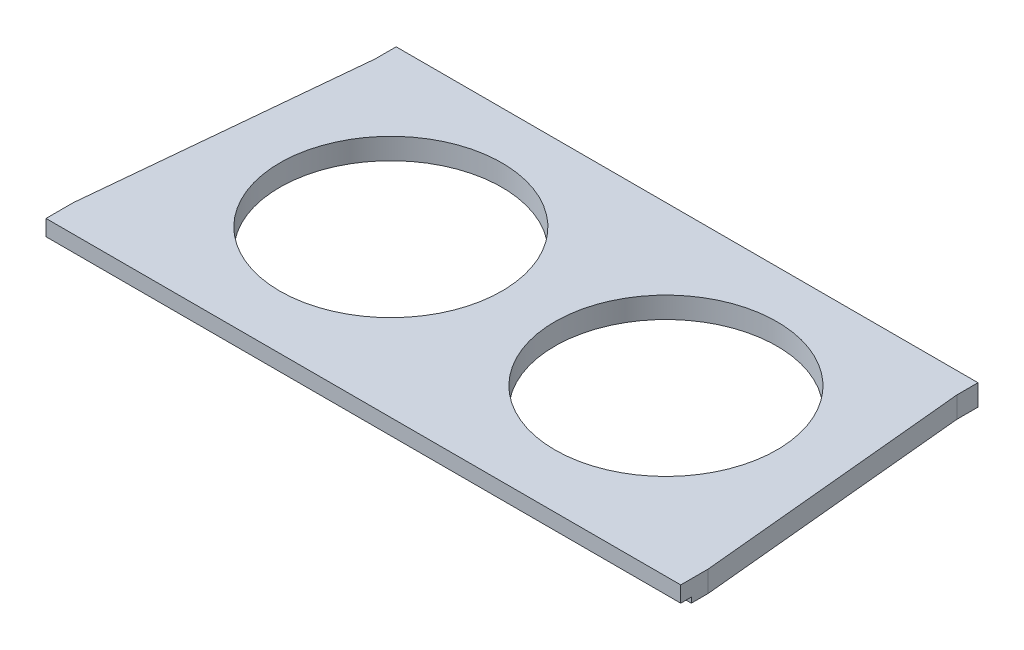
ISO-10303-21;
HEADER;
FILE_DESCRIPTION(('STEP AP214'),'2;1');
FILE_NAME('part.step','',(''),(''),'','','');
FILE_SCHEMA(('AUTOMOTIVE_DESIGN { 1 0 10303 214 1 1 1 1 }'));
ENDSEC;
DATA;
#1=APPLICATION_CONTEXT('core data for automotive mechanical design processes');
#2=APPLICATION_PROTOCOL_DEFINITION('international standard','automotive_design',2000,#1);
#3=PRODUCT_CONTEXT('',#1,'mechanical');
#4=PRODUCT('Part','Part','',(#3));
#5=PRODUCT_RELATED_PRODUCT_CATEGORY('part','',(#4));
#6=PRODUCT_DEFINITION_FORMATION('','',#4);
#7=PRODUCT_DEFINITION_CONTEXT('part definition',#1,'design');
#8=PRODUCT_DEFINITION('design','',#6,#7);
#9=PRODUCT_DEFINITION_SHAPE('','',#8);
#10=(LENGTH_UNIT() NAMED_UNIT(*) SI_UNIT(.MILLI.,.METRE.));
#11=(NAMED_UNIT(*) PLANE_ANGLE_UNIT() SI_UNIT($,.RADIAN.));
#12=(NAMED_UNIT(*) SI_UNIT($,.STERADIAN.) SOLID_ANGLE_UNIT());
#13=UNCERTAINTY_MEASURE_WITH_UNIT(LENGTH_MEASURE(1.E-05),#10,'distance_accuracy_value','');
#14=(GEOMETRIC_REPRESENTATION_CONTEXT(3) GLOBAL_UNCERTAINTY_ASSIGNED_CONTEXT((#13)) GLOBAL_UNIT_ASSIGNED_CONTEXT((#10,
#11,#12)) REPRESENTATION_CONTEXT('',''));
#15=CARTESIAN_POINT('',(0.,0.,0.));
#16=DIRECTION('',(0.,0.,1.));
#17=DIRECTION('',(1.,0.,0.));
#18=AXIS2_PLACEMENT_3D('',#15,#16,#17);
#19=CARTESIAN_POINT('',(0.,5.,0.));
#20=DIRECTION('',(0.,1.,0.));
#21=DIRECTION('',(0.,0.,1.));
#22=AXIS2_PLACEMENT_3D('',#19,#20,#21);
#23=PLANE('',#22);
#24=DIRECTION('',(-1.,0.,0.));
#25=VECTOR('',#24,1.);
#26=CARTESIAN_POINT('',(0.,5.,156.));
#27=LINE('',#26,#25);
#28=CARTESIAN_POINT('',(300.,5.,156.));
#29=VERTEX_POINT('',#28);
#30=CARTESIAN_POINT('',(-300.,5.,156.));
#31=VERTEX_POINT('',#30);
#32=EDGE_CURVE('E199',#29,#31,#27,.T.);
#33=ORIENTED_EDGE('',*,*,#32,.T.);
#34=DIRECTION('',(0.,0.,-1.));
#35=VECTOR('',#34,1.);
#36=CARTESIAN_POINT('',(-300.,5.,150.));
#37=LINE('',#36,#35);
#38=CARTESIAN_POINT('',(-300.,5.,146.));
#39=VERTEX_POINT('',#38);
#40=EDGE_CURVE('E204',#31,#39,#37,.T.);
#41=ORIENTED_EDGE('',*,*,#40,.T.);
#42=DIRECTION('',(-1.,0.,0.));
#43=VECTOR('',#42,1.);
#44=CARTESIAN_POINT('',(300.,5.,146.));
#45=LINE('',#44,#43);
#46=CARTESIAN_POINT('',(300.,5.,146.));
#47=VERTEX_POINT('',#46);
#48=EDGE_CURVE('E122',#39,#47,#45,.F.);
#49=ORIENTED_EDGE('',*,*,#48,.T.);
#50=DIRECTION('',(0.,0.,1.));
#51=VECTOR('',#50,1.);
#52=CARTESIAN_POINT('',(300.,5.,150.));
#53=LINE('',#52,#51);
#54=EDGE_CURVE('E193',#47,#29,#53,.T.);
#55=ORIENTED_EDGE('',*,*,#54,.T.);
#56=EDGE_LOOP('',(#33,#41,#49,#55));
#57=FACE_BOUND('',#56,.T.);
#58=ADVANCED_FACE('F16',(#57),#23,.F.);
#59=CARTESIAN_POINT('',(300.,5.,146.));
#60=DIRECTION('',(0.,0.,-1.));
#61=DIRECTION('',(-1.,0.,0.));
#62=AXIS2_PLACEMENT_3D('',#59,#60,#61);
#63=PLANE('',#62);
#64=DIRECTION('',(0.,1.,0.));
#65=VECTOR('',#64,1.);
#66=CARTESIAN_POINT('',(300.,20.,146.));
#67=LINE('',#66,#65);
#68=CARTESIAN_POINT('',(300.,0.,146.));
#69=VERTEX_POINT('',#68);
#70=EDGE_CURVE('E113',#69,#47,#67,.T.);
#71=ORIENTED_EDGE('',*,*,#70,.T.);
#72=ORIENTED_EDGE('',*,*,#48,.F.);
#73=DIRECTION('',(0.,1.,0.));
#74=VECTOR('',#73,1.);
#75=CARTESIAN_POINT('',(-300.,20.,146.));
#76=LINE('',#75,#74);
#77=CARTESIAN_POINT('',(-300.,0.,146.));
#78=VERTEX_POINT('',#77);
#79=EDGE_CURVE('E207',#39,#78,#76,.F.);
#80=ORIENTED_EDGE('',*,*,#79,.T.);
#81=DIRECTION('',(1.,0.,0.));
#82=VECTOR('',#81,1.);
#83=CARTESIAN_POINT('',(0.,0.,146.));
#84=LINE('',#83,#82);
#85=EDGE_CURVE('E90',#69,#78,#84,.F.);
#86=ORIENTED_EDGE('',*,*,#85,.F.);
#87=EDGE_LOOP('',(#71,#72,#80,#86));
#88=FACE_BOUND('',#87,.T.);
#89=ADVANCED_FACE('F185',(#88),#63,.F.);
#90=CARTESIAN_POINT('',(0.,0.,0.));
#91=DIRECTION('',(0.,-1.,0.));
#92=DIRECTION('',(0.,0.,-1.));
#93=AXIS2_PLACEMENT_3D('',#90,#91,#92);
#94=PLANE('',#93);
#95=CARTESIAN_POINT('',(130.,0.,0.));
#96=DIRECTION('',(0.,1.,0.));
#97=DIRECTION('',(0.,0.,1.));
#98=AXIS2_PLACEMENT_3D('',#95,#96,#97);
#99=CIRCLE('',#98,105.);
#100=CARTESIAN_POINT('',(130.,0.,105.));
#101=VERTEX_POINT('',#100);
#102=EDGE_CURVE('E106',#101,#101,#99,.T.);
#103=ORIENTED_EDGE('',*,*,#102,.T.);
#104=EDGE_LOOP('',(#103));
#105=FACE_BOUND('',#104,.T.);
#106=CARTESIAN_POINT('',(-130.,0.,0.));
#107=DIRECTION('',(0.,1.,0.));
#108=DIRECTION('',(0.,0.,1.));
#109=AXIS2_PLACEMENT_3D('',#106,#107,#108);
#110=CIRCLE('',#109,105.);
#111=CARTESIAN_POINT('',(-130.,0.,105.));
#112=VERTEX_POINT('',#111);
#113=EDGE_CURVE('E19',#112,#112,#110,.T.);
#114=ORIENTED_EDGE('',*,*,#113,.T.);
#115=EDGE_LOOP('',(#114));
#116=FACE_BOUND('',#115,.T.);
#117=DIRECTION('',(-0.0957124066442579,0.,-0.995409029100281));
#118=VECTOR('',#117,1.);
#119=CARTESIAN_POINT('',(275.,0.,-130.));
#120=LINE('',#119,#118);
#121=CARTESIAN_POINT('',(300.,0.,130.));
#122=VERTEX_POINT('',#121);
#123=CARTESIAN_POINT('',(275.,0.,-130.));
#124=VERTEX_POINT('',#123);
#125=EDGE_CURVE('E96',#122,#124,#120,.T.);
#126=ORIENTED_EDGE('',*,*,#125,.F.);
#127=DIRECTION('',(0.,0.,1.));
#128=VECTOR('',#127,1.);
#129=CARTESIAN_POINT('',(300.,0.,150.));
#130=LINE('',#129,#128);
#131=EDGE_CURVE('E99',#122,#69,#130,.T.);
#132=ORIENTED_EDGE('',*,*,#131,.T.);
#133=ORIENTED_EDGE('',*,*,#85,.T.);
#134=DIRECTION('',(0.,0.,-1.));
#135=VECTOR('',#134,1.);
#136=CARTESIAN_POINT('',(-300.,0.,150.));
#137=LINE('',#136,#135);
#138=CARTESIAN_POINT('',(-300.,0.,130.));
#139=VERTEX_POINT('',#138);
#140=EDGE_CURVE('E209',#78,#139,#137,.T.);
#141=ORIENTED_EDGE('',*,*,#140,.T.);
#142=DIRECTION('',(0.0957124066442579,0.,-0.995409029100281));
#143=VECTOR('',#142,1.);
#144=CARTESIAN_POINT('',(-275.,0.,-130.));
#145=LINE('',#144,#143);
#146=CARTESIAN_POINT('',(-275.,0.,-130.));
#147=VERTEX_POINT('',#146);
#148=EDGE_CURVE('E214',#139,#147,#145,.T.);
#149=ORIENTED_EDGE('',*,*,#148,.T.);
#150=DIRECTION('',(0.,0.,-1.));
#151=VECTOR('',#150,1.);
#152=CARTESIAN_POINT('',(-275.,0.,-130.));
#153=LINE('',#152,#151);
#154=CARTESIAN_POINT('',(-275.,0.,-150.));
#155=VERTEX_POINT('',#154);
#156=EDGE_CURVE('E219',#147,#155,#153,.T.);
#157=ORIENTED_EDGE('',*,*,#156,.T.);
#158=DIRECTION('',(1.,0.,0.));
#159=VECTOR('',#158,1.);
#160=CARTESIAN_POINT('',(-300.,0.,-150.));
#161=LINE('',#160,#159);
#162=CARTESIAN_POINT('',(275.,0.,-150.));
#163=VERTEX_POINT('',#162);
#164=EDGE_CURVE('E224',#155,#163,#161,.T.);
#165=ORIENTED_EDGE('',*,*,#164,.T.);
#166=DIRECTION('',(0.,0.,-1.));
#167=VECTOR('',#166,1.);
#168=CARTESIAN_POINT('',(275.,0.,-130.));
#169=LINE('',#168,#167);
#170=EDGE_CURVE('E100',#124,#163,#169,.T.);
#171=ORIENTED_EDGE('',*,*,#170,.F.);
#172=EDGE_LOOP('',(#126,#132,#133,#141,#149,#157,#165,#171));
#173=FACE_BOUND('',#172,.T.);
#174=ADVANCED_FACE('F98',(#105,#116,#173),#94,.T.);
#175=CARTESIAN_POINT('',(-130.,0.,0.));
#176=DIRECTION('',(0.,1.,0.));
#177=DIRECTION('',(0.,0.,1.));
#178=AXIS2_PLACEMENT_3D('',#175,#176,#177);
#179=CYLINDRICAL_SURFACE('',#178,105.);
#180=ORIENTED_EDGE('',*,*,#113,.F.);
#181=EDGE_LOOP('',(#180));
#182=FACE_BOUND('',#181,.T.);
#183=CARTESIAN_POINT('',(-130.,20.,0.));
#184=DIRECTION('',(0.,1.,0.));
#185=DIRECTION('',(0.,0.,1.));
#186=AXIS2_PLACEMENT_3D('',#183,#184,#185);
#187=CIRCLE('',#186,105.);
#188=CARTESIAN_POINT('',(-130.,20.,105.));
#189=VERTEX_POINT('',#188);
#190=EDGE_CURVE('E127',#189,#189,#187,.T.);
#191=ORIENTED_EDGE('',*,*,#190,.T.);
#192=EDGE_LOOP('',(#191));
#193=FACE_BOUND('',#192,.T.);
#194=ADVANCED_FACE('F136',(#182,#193),#179,.F.);
#195=CARTESIAN_POINT('',(130.,0.,0.));
#196=DIRECTION('',(0.,1.,0.));
#197=DIRECTION('',(0.,0.,1.));
#198=AXIS2_PLACEMENT_3D('',#195,#196,#197);
#199=CYLINDRICAL_SURFACE('',#198,105.);
#200=ORIENTED_EDGE('',*,*,#102,.F.);
#201=EDGE_LOOP('',(#200));
#202=FACE_BOUND('',#201,.T.);
#203=CARTESIAN_POINT('',(130.,20.,0.));
#204=DIRECTION('',(0.,1.,0.));
#205=DIRECTION('',(0.,0.,1.));
#206=AXIS2_PLACEMENT_3D('',#203,#204,#205);
#207=CIRCLE('',#206,105.);
#208=CARTESIAN_POINT('',(130.,20.,105.));
#209=VERTEX_POINT('',#208);
#210=EDGE_CURVE('E124',#209,#209,#207,.T.);
#211=ORIENTED_EDGE('',*,*,#210,.T.);
#212=EDGE_LOOP('',(#211));
#213=FACE_BOUND('',#212,.T.);
#214=ADVANCED_FACE('F139',(#202,#213),#199,.F.);
#215=CARTESIAN_POINT('',(275.,883.898086778126,-130.));
#216=DIRECTION('',(0.995409029100281,0.,-0.0957124066442579));
#217=DIRECTION('',(-0.0957124066442579,0.,-0.995409029100281));
#218=AXIS2_PLACEMENT_3D('',#215,#216,#217);
#219=PLANE('',#218);
#220=DIRECTION('',(0.,1.,0.));
#221=VECTOR('',#220,1.);
#222=CARTESIAN_POINT('',(300.,20.,130.));
#223=LINE('',#222,#221);
#224=CARTESIAN_POINT('',(300.,20.,130.));
#225=VERTEX_POINT('',#224);
#226=EDGE_CURVE('E105',#225,#122,#223,.F.);
#227=ORIENTED_EDGE('',*,*,#226,.T.);
#228=ORIENTED_EDGE('',*,*,#125,.T.);
#229=DIRECTION('',(0.,1.,0.));
#230=VECTOR('',#229,1.);
#231=CARTESIAN_POINT('',(275.,883.898086778126,-130.));
#232=LINE('',#231,#230);
#233=CARTESIAN_POINT('',(275.,20.,-130.));
#234=VERTEX_POINT('',#233);
#235=EDGE_CURVE('E227',#234,#124,#232,.F.);
#236=ORIENTED_EDGE('',*,*,#235,.F.);
#237=DIRECTION('',(0.0957124066442579,0.,0.995409029100281));
#238=VECTOR('',#237,1.);
#239=CARTESIAN_POINT('',(275.,20.,-130.));
#240=LINE('',#239,#238);
#241=EDGE_CURVE('E117',#234,#225,#240,.T.);
#242=ORIENTED_EDGE('',*,*,#241,.T.);
#243=EDGE_LOOP('',(#227,#228,#236,#242));
#244=FACE_BOUND('',#243,.T.);
#245=ADVANCED_FACE('F116',(#244),#219,.T.);
#246=CARTESIAN_POINT('',(300.,20.,150.));
#247=DIRECTION('',(-1.,0.,0.));
#248=DIRECTION('',(0.,0.,1.));
#249=AXIS2_PLACEMENT_3D('',#246,#247,#248);
#250=PLANE('',#249);
#251=ORIENTED_EDGE('',*,*,#70,.F.);
#252=ORIENTED_EDGE('',*,*,#131,.F.);
#253=ORIENTED_EDGE('',*,*,#226,.F.);
#254=DIRECTION('',(0.,0.,-1.));
#255=VECTOR('',#254,1.);
#256=CARTESIAN_POINT('',(300.,20.,0.));
#257=LINE('',#256,#255);
#258=CARTESIAN_POINT('',(300.,20.,156.));
#259=VERTEX_POINT('',#258);
#260=EDGE_CURVE('E231',#225,#259,#257,.F.);
#261=ORIENTED_EDGE('',*,*,#260,.T.);
#262=DIRECTION('',(0.,1.,0.));
#263=VECTOR('',#262,1.);
#264=CARTESIAN_POINT('',(300.,0.,156.));
#265=LINE('',#264,#263);
#266=EDGE_CURVE('E194',#259,#29,#265,.F.);
#267=ORIENTED_EDGE('',*,*,#266,.T.);
#268=ORIENTED_EDGE('',*,*,#54,.F.);
#269=EDGE_LOOP('',(#251,#252,#253,#261,#267,#268));
#270=FACE_BOUND('',#269,.T.);
#271=ADVANCED_FACE('F109',(#270),#250,.F.);
#272=CARTESIAN_POINT('',(0.,0.,156.));
#273=DIRECTION('',(0.,0.,-1.));
#274=DIRECTION('',(-1.,0.,0.));
#275=AXIS2_PLACEMENT_3D('',#272,#273,#274);
#276=PLANE('',#275);
#277=ORIENTED_EDGE('',*,*,#32,.F.);
#278=ORIENTED_EDGE('',*,*,#266,.F.);
#279=DIRECTION('',(1.,0.,0.));
#280=VECTOR('',#279,1.);
#281=CARTESIAN_POINT('',(0.,20.,156.));
#282=LINE('',#281,#280);
#283=CARTESIAN_POINT('',(-300.,20.,156.));
#284=VERTEX_POINT('',#283);
#285=EDGE_CURVE('E233',#259,#284,#282,.F.);
#286=ORIENTED_EDGE('',*,*,#285,.T.);
#287=DIRECTION('',(0.,1.,0.));
#288=VECTOR('',#287,1.);
#289=CARTESIAN_POINT('',(-300.,20.,156.));
#290=LINE('',#289,#288);
#291=EDGE_CURVE('E201',#284,#31,#290,.F.);
#292=ORIENTED_EDGE('',*,*,#291,.T.);
#293=EDGE_LOOP('',(#277,#278,#286,#292));
#294=FACE_BOUND('',#293,.T.);
#295=ADVANCED_FACE('F172',(#294),#276,.F.);
#296=CARTESIAN_POINT('',(-300.,20.,150.));
#297=DIRECTION('',(1.,0.,0.));
#298=DIRECTION('',(0.,0.,-1.));
#299=AXIS2_PLACEMENT_3D('',#296,#297,#298);
#300=PLANE('',#299);
#301=ORIENTED_EDGE('',*,*,#79,.F.);
#302=ORIENTED_EDGE('',*,*,#40,.F.);
#303=ORIENTED_EDGE('',*,*,#291,.F.);
#304=DIRECTION('',(0.,0.,-1.));
#305=VECTOR('',#304,1.);
#306=CARTESIAN_POINT('',(-300.,20.,0.));
#307=LINE('',#306,#305);
#308=CARTESIAN_POINT('',(-300.,20.,130.));
#309=VERTEX_POINT('',#308);
#310=EDGE_CURVE('E236',#284,#309,#307,.T.);
#311=ORIENTED_EDGE('',*,*,#310,.T.);
#312=DIRECTION('',(0.,1.,0.));
#313=VECTOR('',#312,1.);
#314=CARTESIAN_POINT('',(-300.,883.898086778126,130.));
#315=LINE('',#314,#313);
#316=EDGE_CURVE('E211',#309,#139,#315,.F.);
#317=ORIENTED_EDGE('',*,*,#316,.T.);
#318=ORIENTED_EDGE('',*,*,#140,.F.);
#319=EDGE_LOOP('',(#301,#302,#303,#311,#317,#318));
#320=FACE_BOUND('',#319,.T.);
#321=ADVANCED_FACE('F168',(#320),#300,.F.);
#322=CARTESIAN_POINT('',(-275.,883.898086778126,-130.));
#323=DIRECTION('',(0.995409029100281,0.,0.0957124066442579));
#324=DIRECTION('',(0.0957124066442579,0.,-0.995409029100281));
#325=AXIS2_PLACEMENT_3D('',#322,#323,#324);
#326=PLANE('',#325);
#327=DIRECTION('',(0.,1.,0.));
#328=VECTOR('',#327,1.);
#329=CARTESIAN_POINT('',(-275.,883.898086778126,-130.));
#330=LINE('',#329,#328);
#331=CARTESIAN_POINT('',(-275.,20.,-130.));
#332=VERTEX_POINT('',#331);
#333=EDGE_CURVE('E216',#332,#147,#330,.F.);
#334=ORIENTED_EDGE('',*,*,#333,.T.);
#335=ORIENTED_EDGE('',*,*,#148,.F.);
#336=ORIENTED_EDGE('',*,*,#316,.F.);
#337=DIRECTION('',(0.095712406644258,0.,-0.995409029100281));
#338=VECTOR('',#337,1.);
#339=CARTESIAN_POINT('',(-300.,20.,130.));
#340=LINE('',#339,#338);
#341=EDGE_CURVE('E239',#309,#332,#340,.T.);
#342=ORIENTED_EDGE('',*,*,#341,.T.);
#343=EDGE_LOOP('',(#334,#335,#336,#342));
#344=FACE_BOUND('',#343,.T.);
#345=ADVANCED_FACE('F164',(#344),#326,.F.);
#346=CARTESIAN_POINT('',(-275.,883.898086778126,-130.));
#347=DIRECTION('',(1.,0.,0.));
#348=DIRECTION('',(0.,0.,-1.));
#349=AXIS2_PLACEMENT_3D('',#346,#347,#348);
#350=PLANE('',#349);
#351=DIRECTION('',(0.,1.,0.));
#352=VECTOR('',#351,1.);
#353=CARTESIAN_POINT('',(-275.,20.,-150.));
#354=LINE('',#353,#352);
#355=CARTESIAN_POINT('',(-275.,20.,-150.));
#356=VERTEX_POINT('',#355);
#357=EDGE_CURVE('E221',#356,#155,#354,.F.);
#358=ORIENTED_EDGE('',*,*,#357,.T.);
#359=ORIENTED_EDGE('',*,*,#156,.F.);
#360=ORIENTED_EDGE('',*,*,#333,.F.);
#361=DIRECTION('',(0.,0.,-1.));
#362=VECTOR('',#361,1.);
#363=CARTESIAN_POINT('',(-275.,20.,0.));
#364=LINE('',#363,#362);
#365=EDGE_CURVE('E242',#332,#356,#364,.T.);
#366=ORIENTED_EDGE('',*,*,#365,.T.);
#367=EDGE_LOOP('',(#358,#359,#360,#366));
#368=FACE_BOUND('',#367,.T.);
#369=ADVANCED_FACE('F160',(#368),#350,.F.);
#370=CARTESIAN_POINT('',(-300.,20.,-150.));
#371=DIRECTION('',(0.,0.,1.));
#372=DIRECTION('',(1.,0.,0.));
#373=AXIS2_PLACEMENT_3D('',#370,#371,#372);
#374=PLANE('',#373);
#375=ORIENTED_EDGE('',*,*,#164,.F.);
#376=ORIENTED_EDGE('',*,*,#357,.F.);
#377=DIRECTION('',(1.,0.,0.));
#378=VECTOR('',#377,1.);
#379=CARTESIAN_POINT('',(0.,20.,-150.));
#380=LINE('',#379,#378);
#381=CARTESIAN_POINT('',(275.,20.,-150.));
#382=VERTEX_POINT('',#381);
#383=EDGE_CURVE('E25',#356,#382,#380,.T.);
#384=ORIENTED_EDGE('',*,*,#383,.T.);
#385=DIRECTION('',(0.,1.,0.));
#386=VECTOR('',#385,1.);
#387=CARTESIAN_POINT('',(275.,883.898086778126,-150.));
#388=LINE('',#387,#386);
#389=EDGE_CURVE('E33',#163,#382,#388,.T.);
#390=ORIENTED_EDGE('',*,*,#389,.F.);
#391=EDGE_LOOP('',(#375,#376,#384,#390));
#392=FACE_BOUND('',#391,.T.);
#393=ADVANCED_FACE('F153',(#392),#374,.F.);
#394=CARTESIAN_POINT('',(275.,883.898086778126,-130.));
#395=DIRECTION('',(1.,0.,0.));
#396=DIRECTION('',(0.,0.,-1.));
#397=AXIS2_PLACEMENT_3D('',#394,#395,#396);
#398=PLANE('',#397);
#399=ORIENTED_EDGE('',*,*,#235,.T.);
#400=ORIENTED_EDGE('',*,*,#170,.T.);
#401=ORIENTED_EDGE('',*,*,#389,.T.);
#402=DIRECTION('',(0.,0.,-1.));
#403=VECTOR('',#402,1.);
#404=CARTESIAN_POINT('',(275.,20.,0.));
#405=LINE('',#404,#403);
#406=EDGE_CURVE('E11',#382,#234,#405,.F.);
#407=ORIENTED_EDGE('',*,*,#406,.T.);
#408=EDGE_LOOP('',(#399,#400,#401,#407));
#409=FACE_BOUND('',#408,.T.);
#410=ADVANCED_FACE('F145',(#409),#398,.T.);
#411=CARTESIAN_POINT('',(0.,20.,0.));
#412=DIRECTION('',(0.,-1.,0.));
#413=DIRECTION('',(0.,0.,-1.));
#414=AXIS2_PLACEMENT_3D('',#411,#412,#413);
#415=PLANE('',#414);
#416=ORIENTED_EDGE('',*,*,#383,.F.);
#417=ORIENTED_EDGE('',*,*,#365,.F.);
#418=ORIENTED_EDGE('',*,*,#341,.F.);
#419=ORIENTED_EDGE('',*,*,#310,.F.);
#420=ORIENTED_EDGE('',*,*,#285,.F.);
#421=ORIENTED_EDGE('',*,*,#260,.F.);
#422=ORIENTED_EDGE('',*,*,#241,.F.);
#423=ORIENTED_EDGE('',*,*,#406,.F.);
#424=EDGE_LOOP('',(#416,#417,#418,#419,#420,#421,#422,#423));
#425=FACE_BOUND('',#424,.T.);
#426=ORIENTED_EDGE('',*,*,#210,.F.);
#427=EDGE_LOOP('',(#426));
#428=FACE_BOUND('',#427,.T.);
#429=ORIENTED_EDGE('',*,*,#190,.F.);
#430=EDGE_LOOP('',(#429));
#431=FACE_BOUND('',#430,.T.);
#432=ADVANCED_FACE('F143',(#425,#428,#431),#415,.F.);
#433=CLOSED_SHELL('',(#58,#89,#174,#194,#214,#245,#271,#295,#321,#345,#369,#393,#410,#432));
#434=MANIFOLD_SOLID_BREP('B1',#433);
#435=ADVANCED_BREP_SHAPE_REPRESENTATION('',(#18,#434),#14);
#436=SHAPE_DEFINITION_REPRESENTATION(#9,#435);
ENDSEC;
END-ISO-10303-21;
